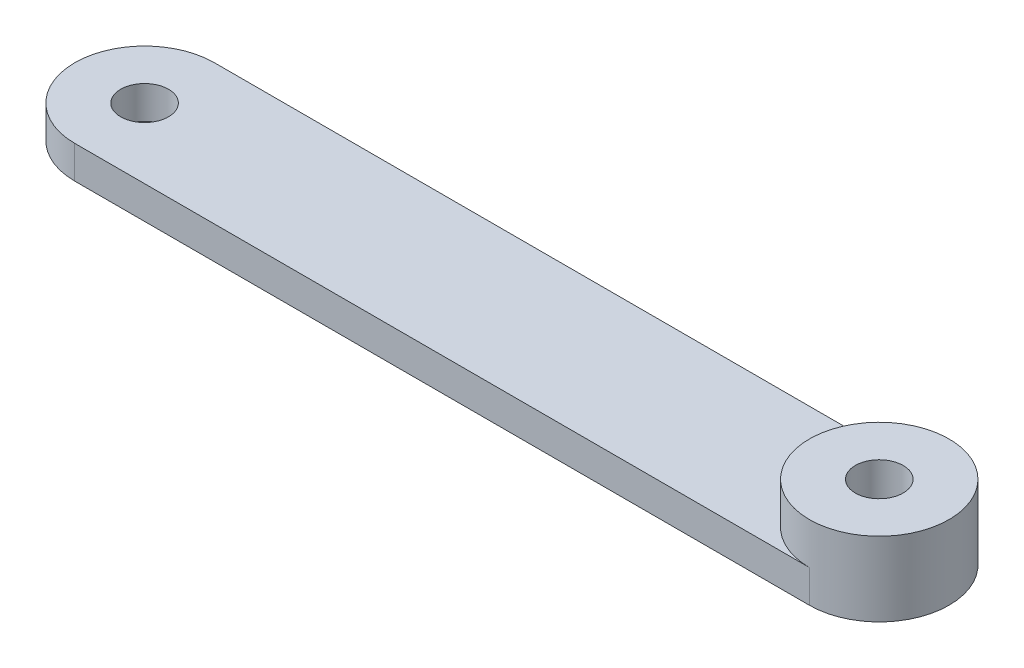
ISO-10303-21;
HEADER;
FILE_DESCRIPTION(('STEP AP214'),'2;1');
FILE_NAME('part.step','',(''),(''),'','','');
FILE_SCHEMA(('AUTOMOTIVE_DESIGN { 1 0 10303 214 1 1 1 1 }'));
ENDSEC;
DATA;
#1=APPLICATION_CONTEXT('core data for automotive mechanical design processes');
#2=APPLICATION_PROTOCOL_DEFINITION('international standard','automotive_design',2000,#1);
#3=PRODUCT_CONTEXT('',#1,'mechanical');
#4=PRODUCT('Part','Part','',(#3));
#5=PRODUCT_RELATED_PRODUCT_CATEGORY('part','',(#4));
#6=PRODUCT_DEFINITION_FORMATION('','',#4);
#7=PRODUCT_DEFINITION_CONTEXT('part definition',#1,'design');
#8=PRODUCT_DEFINITION('design','',#6,#7);
#9=PRODUCT_DEFINITION_SHAPE('','',#8);
#10=(LENGTH_UNIT() NAMED_UNIT(*) SI_UNIT(.MILLI.,.METRE.));
#11=(NAMED_UNIT(*) PLANE_ANGLE_UNIT() SI_UNIT($,.RADIAN.));
#12=(NAMED_UNIT(*) SI_UNIT($,.STERADIAN.) SOLID_ANGLE_UNIT());
#13=UNCERTAINTY_MEASURE_WITH_UNIT(LENGTH_MEASURE(1.E-05),#10,'distance_accuracy_value','');
#14=(GEOMETRIC_REPRESENTATION_CONTEXT(3) GLOBAL_UNCERTAINTY_ASSIGNED_CONTEXT((#13)) GLOBAL_UNIT_ASSIGNED_CONTEXT((#10,
#11,#12)) REPRESENTATION_CONTEXT('',''));
#15=CARTESIAN_POINT('',(0.,0.,0.));
#16=DIRECTION('',(0.,0.,1.));
#17=DIRECTION('',(1.,0.,0.));
#18=AXIS2_PLACEMENT_3D('',#15,#16,#17);
#19=CARTESIAN_POINT('',(-23.1719298245614,2.975,0.724122807017544));
#20=DIRECTION('',(0.,-1.,0.));
#21=DIRECTION('',(0.,0.,-1.));
#22=AXIS2_PLACEMENT_3D('',#19,#20,#21);
#23=CYLINDRICAL_SURFACE('',#22,6.35);
#24=CARTESIAN_POINT('',(-23.1719298245614,0.,0.724122807017544));
#25=DIRECTION('',(0.,1.,0.));
#26=DIRECTION('',(0.,0.,1.));
#27=AXIS2_PLACEMENT_3D('',#24,#25,#26);
#28=CIRCLE('',#27,6.35);
#29=CARTESIAN_POINT('',(-23.1719298245614,0.,-5.62587719298245));
#30=VERTEX_POINT('',#29);
#31=CARTESIAN_POINT('',(-23.1719298245614,0.,7.07412280701754));
#32=VERTEX_POINT('',#31);
#33=EDGE_CURVE('E131',#30,#32,#28,.T.);
#34=ORIENTED_EDGE('',*,*,#33,.T.);
#35=DIRECTION('',(0.,-1.,0.));
#36=VECTOR('',#35,1.);
#37=CARTESIAN_POINT('',(-23.1719298245614,2.975,7.07412280701754));
#38=LINE('',#37,#36);
#39=CARTESIAN_POINT('',(-23.1719298245614,2.975,7.07412280701754));
#40=VERTEX_POINT('',#39);
#41=EDGE_CURVE('E11',#40,#32,#38,.T.);
#42=ORIENTED_EDGE('',*,*,#41,.F.);
#43=CARTESIAN_POINT('',(-23.1719298245614,2.975,0.724122807017544));
#44=DIRECTION('',(0.,1.,0.));
#45=DIRECTION('',(0.,0.,1.));
#46=AXIS2_PLACEMENT_3D('',#43,#44,#45);
#47=CIRCLE('',#46,6.35);
#48=CARTESIAN_POINT('',(-23.1719298245614,2.975,-5.62587719298245));
#49=VERTEX_POINT('',#48);
#50=EDGE_CURVE('E126',#49,#40,#47,.T.);
#51=ORIENTED_EDGE('',*,*,#50,.F.);
#52=DIRECTION('',(0.,-1.,0.));
#53=VECTOR('',#52,1.);
#54=CARTESIAN_POINT('',(-23.1719298245614,2.975,-5.62587719298245));
#55=LINE('',#54,#53);
#56=EDGE_CURVE('E96',#49,#30,#55,.T.);
#57=ORIENTED_EDGE('',*,*,#56,.T.);
#58=EDGE_LOOP('',(#34,#42,#51,#57));
#59=FACE_BOUND('',#58,.T.);
#60=ADVANCED_FACE('F44',(#59),#23,.T.);
#61=CARTESIAN_POINT('',(-23.1719298245614,2.975,7.07412280701754));
#62=DIRECTION('',(0.,0.,-1.));
#63=DIRECTION('',(-1.,0.,0.));
#64=AXIS2_PLACEMENT_3D('',#61,#62,#63);
#65=PLANE('',#64);
#66=DIRECTION('',(1.,0.,0.));
#67=VECTOR('',#66,1.);
#68=CARTESIAN_POINT('',(-23.1719298245614,0.,7.07412280701754));
#69=LINE('',#68,#67);
#70=CARTESIAN_POINT('',(43.6280701754386,0.,7.07412280701754));
#71=VERTEX_POINT('',#70);
#72=EDGE_CURVE('E135',#32,#71,#69,.T.);
#73=ORIENTED_EDGE('',*,*,#72,.T.);
#74=DIRECTION('',(0.,-1.,0.));
#75=VECTOR('',#74,1.);
#76=CARTESIAN_POINT('',(43.6280701754386,2.975,7.07412280701754));
#77=LINE('',#76,#75);
#78=CARTESIAN_POINT('',(43.6280701754386,2.975,7.07412280701754));
#79=VERTEX_POINT('',#78);
#80=EDGE_CURVE('E54',#79,#71,#77,.T.);
#81=ORIENTED_EDGE('',*,*,#80,.F.);
#82=DIRECTION('',(1.,0.,0.));
#83=VECTOR('',#82,1.);
#84=CARTESIAN_POINT('',(-23.1719298245614,2.975,7.07412280701754));
#85=LINE('',#84,#83);
#86=EDGE_CURVE('E92',#40,#79,#85,.T.);
#87=ORIENTED_EDGE('',*,*,#86,.F.);
#88=ORIENTED_EDGE('',*,*,#41,.T.);
#89=EDGE_LOOP('',(#73,#81,#87,#88));
#90=FACE_BOUND('',#89,.T.);
#91=ADVANCED_FACE('F174',(#90),#65,.F.);
#92=CARTESIAN_POINT('',(43.6280701754386,2.975,0.724122807017545));
#93=DIRECTION('',(0.,-1.,0.));
#94=DIRECTION('',(0.,0.,-1.));
#95=AXIS2_PLACEMENT_3D('',#92,#93,#94);
#96=CYLINDRICAL_SURFACE('',#95,6.35);
#97=CARTESIAN_POINT('',(43.6280701754386,0.,0.724122807017545));
#98=DIRECTION('',(0.,1.,0.));
#99=DIRECTION('',(0.,0.,-1.));
#100=AXIS2_PLACEMENT_3D('',#97,#98,#99);
#101=CIRCLE('',#100,6.35);
#102=CARTESIAN_POINT('',(43.6280701754386,0.,-5.62587719298245));
#103=VERTEX_POINT('',#102);
#104=EDGE_CURVE('E82',#71,#103,#101,.T.);
#105=ORIENTED_EDGE('',*,*,#104,.T.);
#106=DIRECTION('',(0.,-1.,0.));
#107=VECTOR('',#106,1.);
#108=CARTESIAN_POINT('',(43.6280701754386,2.975,-5.62587719298245));
#109=LINE('',#108,#107);
#110=CARTESIAN_POINT('',(43.6280701754386,2.975,-5.62587719298245));
#111=VERTEX_POINT('',#110);
#112=EDGE_CURVE('E95',#111,#103,#109,.T.);
#113=ORIENTED_EDGE('',*,*,#112,.F.);
#114=CARTESIAN_POINT('',(43.6280701754386,2.975,0.724122807017545));
#115=DIRECTION('',(0.,1.,0.));
#116=DIRECTION('',(0.,0.,-1.));
#117=AXIS2_PLACEMENT_3D('',#114,#115,#116);
#118=CIRCLE('',#117,6.35);
#119=EDGE_CURVE('E103',#111,#79,#118,.T.);
#120=ORIENTED_EDGE('',*,*,#119,.T.);
#121=ORIENTED_EDGE('',*,*,#80,.T.);
#122=EDGE_LOOP('',(#105,#113,#120,#121));
#123=FACE_BOUND('',#122,.T.);
#124=CARTESIAN_POINT('',(43.6280701754386,6.75,0.724122807017545));
#125=DIRECTION('',(0.,1.,0.));
#126=DIRECTION('',(0.,0.,1.));
#127=AXIS2_PLACEMENT_3D('',#124,#125,#126);
#128=CIRCLE('',#127,6.35);
#129=CARTESIAN_POINT('',(43.6280701754386,6.75,7.07412280701755));
#130=VERTEX_POINT('',#129);
#131=EDGE_CURVE('E109',#130,#130,#128,.T.);
#132=ORIENTED_EDGE('',*,*,#131,.F.);
#133=EDGE_LOOP('',(#132));
#134=FACE_BOUND('',#133,.T.);
#135=ADVANCED_FACE('F101',(#123,#134),#96,.T.);
#136=CARTESIAN_POINT('',(-23.1719298245614,2.975,-5.62587719298245));
#137=DIRECTION('',(0.,0.,1.));
#138=DIRECTION('',(1.,0.,0.));
#139=AXIS2_PLACEMENT_3D('',#136,#137,#138);
#140=PLANE('',#139);
#141=DIRECTION('',(-1.,0.,0.));
#142=VECTOR('',#141,1.);
#143=CARTESIAN_POINT('',(-23.1719298245614,0.,-5.62587719298245));
#144=LINE('',#143,#142);
#145=EDGE_CURVE('E87',#103,#30,#144,.T.);
#146=ORIENTED_EDGE('',*,*,#145,.T.);
#147=ORIENTED_EDGE('',*,*,#56,.F.);
#148=DIRECTION('',(-1.,0.,0.));
#149=VECTOR('',#148,1.);
#150=CARTESIAN_POINT('',(-23.1719298245614,2.975,-5.62587719298245));
#151=LINE('',#150,#149);
#152=EDGE_CURVE('E63',#111,#49,#151,.T.);
#153=ORIENTED_EDGE('',*,*,#152,.F.);
#154=ORIENTED_EDGE('',*,*,#112,.T.);
#155=EDGE_LOOP('',(#146,#147,#153,#154));
#156=FACE_BOUND('',#155,.T.);
#157=ADVANCED_FACE('F94',(#156),#140,.F.);
#158=CARTESIAN_POINT('',(-23.1719298245614,2.975,0.724122807017544));
#159=DIRECTION('',(0.,1.,0.));
#160=DIRECTION('',(0.,0.,1.));
#161=AXIS2_PLACEMENT_3D('',#158,#159,#160);
#162=PLANE('',#161);
#163=ORIENTED_EDGE('',*,*,#119,.F.);
#164=ORIENTED_EDGE('',*,*,#152,.T.);
#165=ORIENTED_EDGE('',*,*,#50,.T.);
#166=ORIENTED_EDGE('',*,*,#86,.T.);
#167=EDGE_LOOP('',(#163,#164,#165,#166));
#168=FACE_BOUND('',#167,.T.);
#169=CARTESIAN_POINT('',(-23.1719298245614,2.975,0.724122807017545));
#170=DIRECTION('',(0.,1.,0.));
#171=DIRECTION('',(0.,0.,1.));
#172=AXIS2_PLACEMENT_3D('',#169,#170,#171);
#173=CIRCLE('',#172,2.175);
#174=CARTESIAN_POINT('',(-23.1719298245614,2.975,2.89912280701754));
#175=VERTEX_POINT('',#174);
#176=EDGE_CURVE('E117',#175,#175,#173,.T.);
#177=ORIENTED_EDGE('',*,*,#176,.F.);
#178=EDGE_LOOP('',(#177));
#179=FACE_BOUND('',#178,.T.);
#180=ADVANCED_FACE('F106',(#168,#179),#162,.T.);
#181=CARTESIAN_POINT('',(-23.1719298245614,0.,0.724122807017544));
#182=DIRECTION('',(0.,1.,0.));
#183=DIRECTION('',(0.,0.,1.));
#184=AXIS2_PLACEMENT_3D('',#181,#182,#183);
#185=PLANE('',#184);
#186=CARTESIAN_POINT('',(-23.1719298245614,0.,0.724122807017545));
#187=DIRECTION('',(0.,1.,0.));
#188=DIRECTION('',(0.,0.,1.));
#189=AXIS2_PLACEMENT_3D('',#186,#187,#188);
#190=CIRCLE('',#189,2.175);
#191=CARTESIAN_POINT('',(-23.1719298245614,0.,2.89912280701754));
#192=VERTEX_POINT('',#191);
#193=EDGE_CURVE('E47',#192,#192,#190,.T.);
#194=ORIENTED_EDGE('',*,*,#193,.T.);
#195=EDGE_LOOP('',(#194));
#196=FACE_BOUND('',#195,.T.);
#197=CARTESIAN_POINT('',(43.6280701754386,0.,0.724122807017545));
#198=DIRECTION('',(0.,1.,0.));
#199=DIRECTION('',(0.,0.,1.));
#200=AXIS2_PLACEMENT_3D('',#197,#198,#199);
#201=CIRCLE('',#200,2.17500000000001);
#202=CARTESIAN_POINT('',(43.6280701754386,0.,2.89912280701755));
#203=VERTEX_POINT('',#202);
#204=EDGE_CURVE('E125',#203,#203,#201,.T.);
#205=ORIENTED_EDGE('',*,*,#204,.T.);
#206=EDGE_LOOP('',(#205));
#207=FACE_BOUND('',#206,.T.);
#208=ORIENTED_EDGE('',*,*,#33,.F.);
#209=ORIENTED_EDGE('',*,*,#145,.F.);
#210=ORIENTED_EDGE('',*,*,#104,.F.);
#211=ORIENTED_EDGE('',*,*,#72,.F.);
#212=EDGE_LOOP('',(#208,#209,#210,#211));
#213=FACE_BOUND('',#212,.T.);
#214=ADVANCED_FACE('F157',(#196,#207,#213),#185,.F.);
#215=CARTESIAN_POINT('',(43.6280701754386,-9.725,0.724122807017545));
#216=DIRECTION('',(0.,1.,0.));
#217=DIRECTION('',(0.,0.,1.));
#218=AXIS2_PLACEMENT_3D('',#215,#216,#217);
#219=CYLINDRICAL_SURFACE('',#218,2.17500000000001);
#220=ORIENTED_EDGE('',*,*,#204,.F.);
#221=EDGE_LOOP('',(#220));
#222=FACE_BOUND('',#221,.T.);
#223=CARTESIAN_POINT('',(43.6280701754386,6.75,0.724122807017545));
#224=DIRECTION('',(0.,1.,0.));
#225=DIRECTION('',(0.,0.,1.));
#226=AXIS2_PLACEMENT_3D('',#223,#224,#225);
#227=CIRCLE('',#226,2.17500000000001);
#228=CARTESIAN_POINT('',(43.6280701754386,6.75,2.89912280701755));
#229=VERTEX_POINT('',#228);
#230=EDGE_CURVE('E110',#229,#229,#227,.T.);
#231=ORIENTED_EDGE('',*,*,#230,.T.);
#232=EDGE_LOOP('',(#231));
#233=FACE_BOUND('',#232,.T.);
#234=ADVANCED_FACE('F162',(#222,#233),#219,.F.);
#235=CARTESIAN_POINT('',(-23.1719298245614,-9.725,0.724122807017545));
#236=DIRECTION('',(0.,1.,0.));
#237=DIRECTION('',(0.,0.,1.));
#238=AXIS2_PLACEMENT_3D('',#235,#236,#237);
#239=CYLINDRICAL_SURFACE('',#238,2.175);
#240=ORIENTED_EDGE('',*,*,#176,.T.);
#241=EDGE_LOOP('',(#240));
#242=FACE_BOUND('',#241,.T.);
#243=ORIENTED_EDGE('',*,*,#193,.F.);
#244=EDGE_LOOP('',(#243));
#245=FACE_BOUND('',#244,.T.);
#246=ADVANCED_FACE('F159',(#242,#245),#239,.F.);
#247=CARTESIAN_POINT('',(43.6280701754386,6.75,0.724122807017545));
#248=DIRECTION('',(0.,1.,0.));
#249=DIRECTION('',(0.,0.,1.));
#250=AXIS2_PLACEMENT_3D('',#247,#248,#249);
#251=PLANE('',#250);
#252=ORIENTED_EDGE('',*,*,#131,.T.);
#253=EDGE_LOOP('',(#252));
#254=FACE_BOUND('',#253,.T.);
#255=ORIENTED_EDGE('',*,*,#230,.F.);
#256=EDGE_LOOP('',(#255));
#257=FACE_BOUND('',#256,.T.);
#258=ADVANCED_FACE('F161',(#254,#257),#251,.T.);
#259=CLOSED_SHELL('',(#60,#91,#135,#157,#180,#214,#234,#246,#258));
#260=MANIFOLD_SOLID_BREP('B2',#259);
#261=ADVANCED_BREP_SHAPE_REPRESENTATION('',(#18,#260),#14);
#262=SHAPE_DEFINITION_REPRESENTATION(#9,#261);
ENDSEC;
END-ISO-10303-21;
